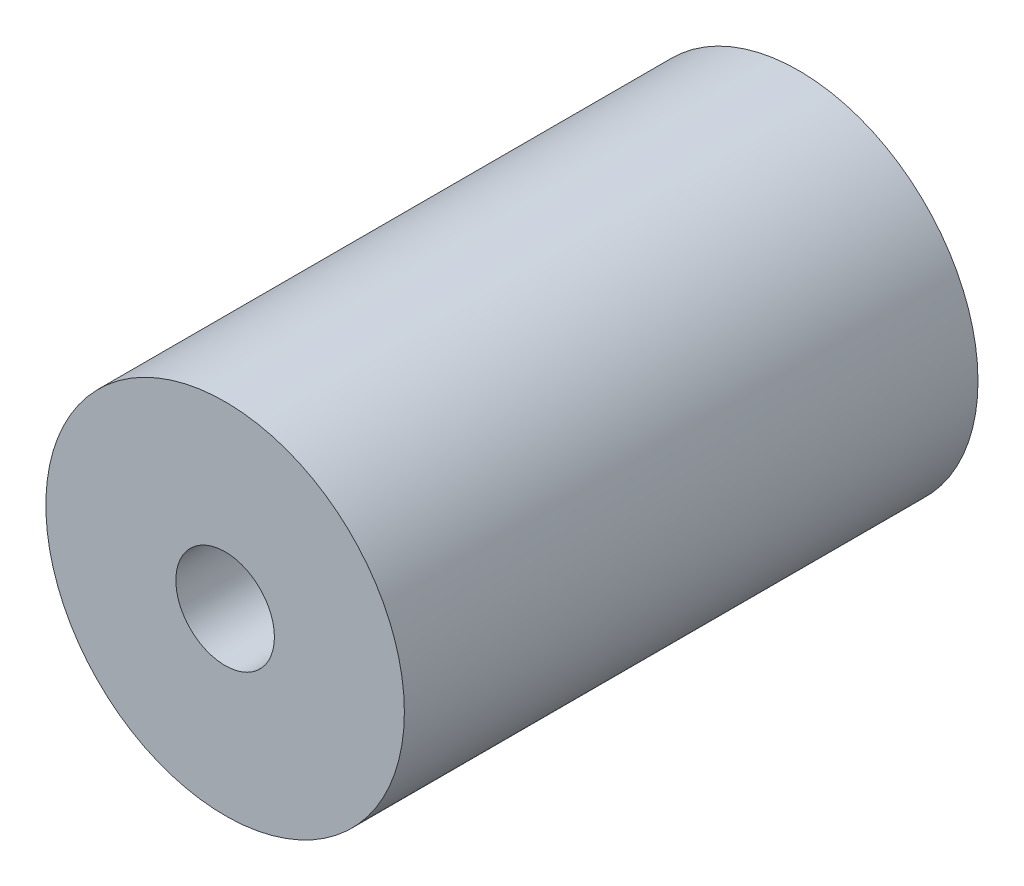
ISO-10303-21;
HEADER;
FILE_DESCRIPTION(('STEP AP214'),'2;1');
FILE_NAME('part.step','',(''),(''),'','','');
FILE_SCHEMA(('AUTOMOTIVE_DESIGN { 1 0 10303 214 1 1 1 1 }'));
ENDSEC;
DATA;
#1=APPLICATION_CONTEXT('core data for automotive mechanical design processes');
#2=APPLICATION_PROTOCOL_DEFINITION('international standard','automotive_design',2000,#1);
#3=PRODUCT_CONTEXT('',#1,'mechanical');
#4=PRODUCT('Part','Part','',(#3));
#5=PRODUCT_RELATED_PRODUCT_CATEGORY('part','',(#4));
#6=PRODUCT_DEFINITION_FORMATION('','',#4);
#7=PRODUCT_DEFINITION_CONTEXT('part definition',#1,'design');
#8=PRODUCT_DEFINITION('design','',#6,#7);
#9=PRODUCT_DEFINITION_SHAPE('','',#8);
#10=(LENGTH_UNIT() NAMED_UNIT(*) SI_UNIT(.MILLI.,.METRE.));
#11=(NAMED_UNIT(*) PLANE_ANGLE_UNIT() SI_UNIT($,.RADIAN.));
#12=(NAMED_UNIT(*) SI_UNIT($,.STERADIAN.) SOLID_ANGLE_UNIT());
#13=UNCERTAINTY_MEASURE_WITH_UNIT(LENGTH_MEASURE(1.E-05),#10,'distance_accuracy_value','');
#14=(GEOMETRIC_REPRESENTATION_CONTEXT(3) GLOBAL_UNCERTAINTY_ASSIGNED_CONTEXT((#13)) GLOBAL_UNIT_ASSIGNED_CONTEXT((#10,
#11,#12)) REPRESENTATION_CONTEXT('',''));
#15=CARTESIAN_POINT('',(0.,0.,0.));
#16=DIRECTION('',(0.,0.,1.));
#17=DIRECTION('',(1.,0.,0.));
#18=AXIS2_PLACEMENT_3D('',#15,#16,#17);
#19=CARTESIAN_POINT('',(0.,0.,32.));
#20=DIRECTION('',(0.,0.,1.));
#21=DIRECTION('',(1.,0.,0.));
#22=AXIS2_PLACEMENT_3D('',#19,#20,#21);
#23=PLANE('',#22);
#24=CARTESIAN_POINT('',(0.,0.,32.));
#25=DIRECTION('',(0.,0.,1.));
#26=DIRECTION('',(1.,0.,0.));
#27=AXIS2_PLACEMENT_3D('',#24,#25,#26);
#28=CIRCLE('',#27,10.);
#29=CARTESIAN_POINT('',(10.,0.,32.));
#30=VERTEX_POINT('',#29);
#31=EDGE_CURVE('E10',#30,#30,#28,.T.);
#32=ORIENTED_EDGE('',*,*,#31,.T.);
#33=EDGE_LOOP('',(#32));
#34=FACE_BOUND('',#33,.T.);
#35=CARTESIAN_POINT('',(0.,0.,32.));
#36=DIRECTION('',(0.,0.,1.));
#37=DIRECTION('',(1.,0.,0.));
#38=AXIS2_PLACEMENT_3D('',#35,#36,#37);
#39=CIRCLE('',#38,2.75);
#40=CARTESIAN_POINT('',(2.75,0.,32.));
#41=VERTEX_POINT('',#40);
#42=EDGE_CURVE('E40',#41,#41,#39,.T.);
#43=ORIENTED_EDGE('',*,*,#42,.F.);
#44=EDGE_LOOP('',(#43));
#45=FACE_BOUND('',#44,.T.);
#46=ADVANCED_FACE('F29',(#34,#45),#23,.T.);
#47=CARTESIAN_POINT('',(0.,0.,0.));
#48=DIRECTION('',(0.,0.,1.));
#49=DIRECTION('',(1.,0.,0.));
#50=AXIS2_PLACEMENT_3D('',#47,#48,#49);
#51=PLANE('',#50);
#52=CARTESIAN_POINT('',(0.,0.,0.));
#53=DIRECTION('',(0.,0.,1.));
#54=DIRECTION('',(1.,0.,0.));
#55=AXIS2_PLACEMENT_3D('',#52,#53,#54);
#56=CIRCLE('',#55,10.);
#57=CARTESIAN_POINT('',(10.,0.,0.));
#58=VERTEX_POINT('',#57);
#59=EDGE_CURVE('E33',#58,#58,#56,.T.);
#60=ORIENTED_EDGE('',*,*,#59,.F.);
#61=EDGE_LOOP('',(#60));
#62=FACE_BOUND('',#61,.T.);
#63=CARTESIAN_POINT('',(0.,0.,0.));
#64=DIRECTION('',(0.,0.,1.));
#65=DIRECTION('',(1.,0.,0.));
#66=AXIS2_PLACEMENT_3D('',#63,#64,#65);
#67=CIRCLE('',#66,2.75);
#68=CARTESIAN_POINT('',(2.75,0.,0.));
#69=VERTEX_POINT('',#68);
#70=EDGE_CURVE('E42',#69,#69,#67,.T.);
#71=ORIENTED_EDGE('',*,*,#70,.T.);
#72=EDGE_LOOP('',(#71));
#73=FACE_BOUND('',#72,.T.);
#74=ADVANCED_FACE('F52',(#62,#73),#51,.F.);
#75=CARTESIAN_POINT('',(0.,0.,32.));
#76=DIRECTION('',(0.,0.,-1.));
#77=DIRECTION('',(-1.,0.,0.));
#78=AXIS2_PLACEMENT_3D('',#75,#76,#77);
#79=CYLINDRICAL_SURFACE('',#78,10.);
#80=ORIENTED_EDGE('',*,*,#31,.F.);
#81=EDGE_LOOP('',(#80));
#82=FACE_BOUND('',#81,.T.);
#83=ORIENTED_EDGE('',*,*,#59,.T.);
#84=EDGE_LOOP('',(#83));
#85=FACE_BOUND('',#84,.T.);
#86=ADVANCED_FACE('F31',(#82,#85),#79,.T.);
#87=CARTESIAN_POINT('',(0.,0.,32.));
#88=DIRECTION('',(0.,0.,-1.));
#89=DIRECTION('',(-1.,0.,0.));
#90=AXIS2_PLACEMENT_3D('',#87,#88,#89);
#91=CYLINDRICAL_SURFACE('',#90,2.75);
#92=ORIENTED_EDGE('',*,*,#42,.T.);
#93=EDGE_LOOP('',(#92));
#94=FACE_BOUND('',#93,.T.);
#95=ORIENTED_EDGE('',*,*,#70,.F.);
#96=EDGE_LOOP('',(#95));
#97=FACE_BOUND('',#96,.T.);
#98=ADVANCED_FACE('F48',(#94,#97),#91,.F.);
#99=CLOSED_SHELL('',(#46,#74,#86,#98));
#100=MANIFOLD_SOLID_BREP('B2',#99);
#101=ADVANCED_BREP_SHAPE_REPRESENTATION('',(#18,#100),#14);
#102=SHAPE_DEFINITION_REPRESENTATION(#9,#101);
ENDSEC;
END-ISO-10303-21;
